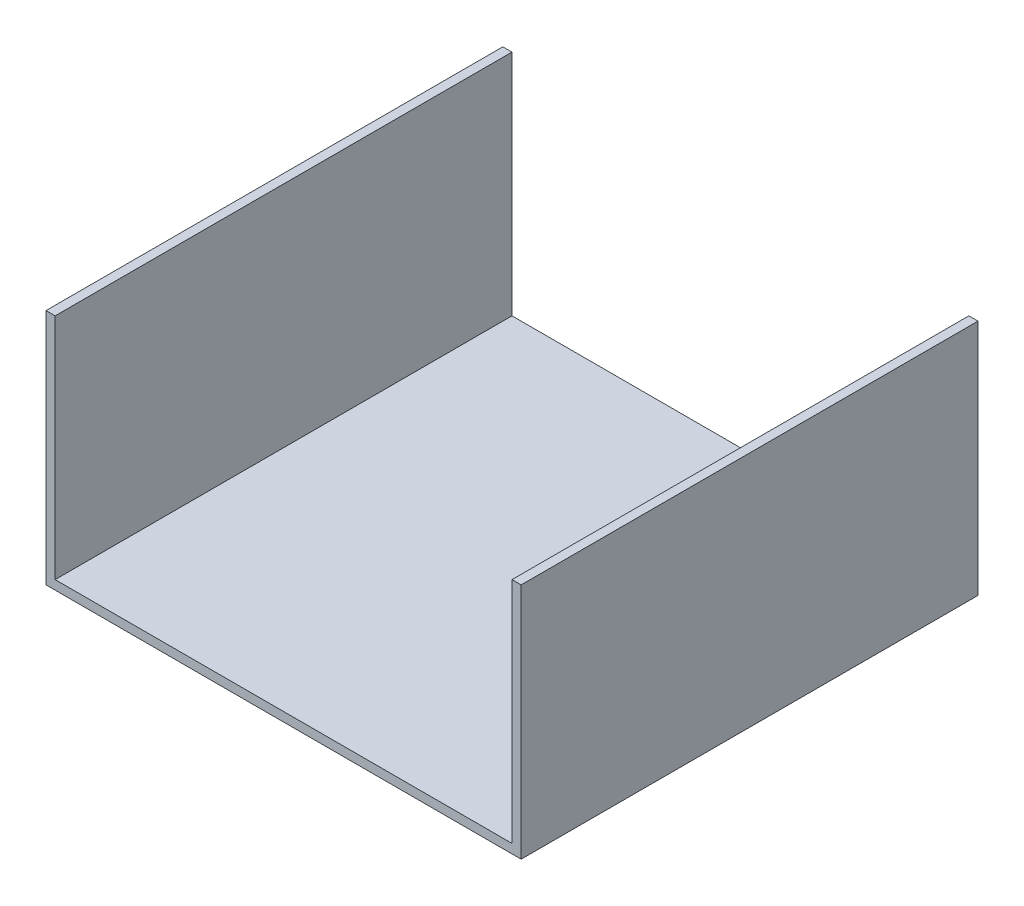
ISO-10303-21;
HEADER;
FILE_DESCRIPTION(('STEP AP214'),'2;1');
FILE_NAME('part.step','',(''),(''),'','','');
FILE_SCHEMA(('AUTOMOTIVE_DESIGN { 1 0 10303 214 1 1 1 1 }'));
ENDSEC;
DATA;
#1=APPLICATION_CONTEXT('core data for automotive mechanical design processes');
#2=APPLICATION_PROTOCOL_DEFINITION('international standard','automotive_design',2000,#1);
#3=PRODUCT_CONTEXT('',#1,'mechanical');
#4=PRODUCT('Part','Part','',(#3));
#5=PRODUCT_RELATED_PRODUCT_CATEGORY('part','',(#4));
#6=PRODUCT_DEFINITION_FORMATION('','',#4);
#7=PRODUCT_DEFINITION_CONTEXT('part definition',#1,'design');
#8=PRODUCT_DEFINITION('design','',#6,#7);
#9=PRODUCT_DEFINITION_SHAPE('','',#8);
#10=(LENGTH_UNIT() NAMED_UNIT(*) SI_UNIT(.MILLI.,.METRE.));
#11=(NAMED_UNIT(*) PLANE_ANGLE_UNIT() SI_UNIT($,.RADIAN.));
#12=(NAMED_UNIT(*) SI_UNIT($,.STERADIAN.) SOLID_ANGLE_UNIT());
#13=UNCERTAINTY_MEASURE_WITH_UNIT(LENGTH_MEASURE(1.E-05),#10,'distance_accuracy_value','');
#14=(GEOMETRIC_REPRESENTATION_CONTEXT(3) GLOBAL_UNCERTAINTY_ASSIGNED_CONTEXT((#13)) GLOBAL_UNIT_ASSIGNED_CONTEXT((#10,
#11,#12)) REPRESENTATION_CONTEXT('',''));
#15=CARTESIAN_POINT('',(0.,0.,0.));
#16=DIRECTION('',(0.,0.,1.));
#17=DIRECTION('',(1.,0.,0.));
#18=AXIS2_PLACEMENT_3D('',#15,#16,#17);
#19=CARTESIAN_POINT('',(-200.,0.,-10000.));
#20=DIRECTION('',(0.,1.,0.));
#21=DIRECTION('',(0.,0.,1.));
#22=AXIS2_PLACEMENT_3D('',#19,#20,#21);
#23=PLANE('',#22);
#24=DIRECTION('',(-1.,0.,0.));
#25=VECTOR('',#24,1.);
#26=CARTESIAN_POINT('',(-200.,0.,0.));
#27=LINE('',#26,#25);
#28=CARTESIAN_POINT('',(0.,0.,0.));
#29=VERTEX_POINT('',#28);
#30=CARTESIAN_POINT('',(-200.,0.,0.));
#31=VERTEX_POINT('',#30);
#32=EDGE_CURVE('E138',#29,#31,#27,.T.);
#33=ORIENTED_EDGE('',*,*,#32,.F.);
#34=DIRECTION('',(0.,0.,1.));
#35=VECTOR('',#34,1.);
#36=CARTESIAN_POINT('',(0.,0.,-10000.));
#37=LINE('',#36,#35);
#38=CARTESIAN_POINT('',(0.,0.,-10000.));
#39=VERTEX_POINT('',#38);
#40=EDGE_CURVE('E11',#39,#29,#37,.T.);
#41=ORIENTED_EDGE('',*,*,#40,.F.);
#42=DIRECTION('',(-1.,0.,0.));
#43=VECTOR('',#42,1.);
#44=CARTESIAN_POINT('',(-200.,0.,-10000.));
#45=LINE('',#44,#43);
#46=CARTESIAN_POINT('',(-200.,0.,-10000.));
#47=VERTEX_POINT('',#46);
#48=EDGE_CURVE('E158',#39,#47,#45,.T.);
#49=ORIENTED_EDGE('',*,*,#48,.T.);
#50=DIRECTION('',(0.,0.,1.));
#51=VECTOR('',#50,1.);
#52=CARTESIAN_POINT('',(-200.,0.,-10000.));
#53=LINE('',#52,#51);
#54=EDGE_CURVE('E44',#47,#31,#53,.T.);
#55=ORIENTED_EDGE('',*,*,#54,.T.);
#56=EDGE_LOOP('',(#33,#41,#49,#55));
#57=FACE_BOUND('',#56,.T.);
#58=ADVANCED_FACE('F41',(#57),#23,.T.);
#59=CARTESIAN_POINT('',(0.,0.,-10000.));
#60=DIRECTION('',(1.,0.,0.));
#61=DIRECTION('',(0.,0.,-1.));
#62=AXIS2_PLACEMENT_3D('',#59,#60,#61);
#63=PLANE('',#62);
#64=DIRECTION('',(0.,1.,0.));
#65=VECTOR('',#64,1.);
#66=CARTESIAN_POINT('',(0.,0.,0.));
#67=LINE('',#66,#65);
#68=CARTESIAN_POINT('',(0.,-5000.,0.));
#69=VERTEX_POINT('',#68);
#70=EDGE_CURVE('E156',#69,#29,#67,.T.);
#71=ORIENTED_EDGE('',*,*,#70,.F.);
#72=DIRECTION('',(0.,0.,1.));
#73=VECTOR('',#72,1.);
#74=CARTESIAN_POINT('',(0.,-5000.,-10000.));
#75=LINE('',#74,#73);
#76=CARTESIAN_POINT('',(0.,-5000.,-10000.));
#77=VERTEX_POINT('',#76);
#78=EDGE_CURVE('E50',#77,#69,#75,.T.);
#79=ORIENTED_EDGE('',*,*,#78,.F.);
#80=DIRECTION('',(0.,1.,0.));
#81=VECTOR('',#80,1.);
#82=CARTESIAN_POINT('',(0.,0.,-10000.));
#83=LINE('',#82,#81);
#84=EDGE_CURVE('E128',#77,#39,#83,.T.);
#85=ORIENTED_EDGE('',*,*,#84,.T.);
#86=ORIENTED_EDGE('',*,*,#40,.T.);
#87=EDGE_LOOP('',(#71,#79,#85,#86));
#88=FACE_BOUND('',#87,.T.);
#89=ADVANCED_FACE('F170',(#88),#63,.T.);
#90=CARTESIAN_POINT('',(0.,-5000.,-10000.));
#91=DIRECTION('',(0.,1.,0.));
#92=DIRECTION('',(0.,0.,1.));
#93=AXIS2_PLACEMENT_3D('',#90,#91,#92);
#94=PLANE('',#93);
#95=DIRECTION('',(-1.,0.,0.));
#96=VECTOR('',#95,1.);
#97=CARTESIAN_POINT('',(0.,-5000.,0.));
#98=LINE('',#97,#96);
#99=CARTESIAN_POINT('',(10000.,-5000.,0.));
#100=VERTEX_POINT('',#99);
#101=EDGE_CURVE('E115',#100,#69,#98,.T.);
#102=ORIENTED_EDGE('',*,*,#101,.F.);
#103=DIRECTION('',(0.,0.,1.));
#104=VECTOR('',#103,1.);
#105=CARTESIAN_POINT('',(10000.,-5000.,-10000.));
#106=LINE('',#105,#104);
#107=CARTESIAN_POINT('',(10000.,-5000.,-10000.));
#108=VERTEX_POINT('',#107);
#109=EDGE_CURVE('E110',#108,#100,#106,.T.);
#110=ORIENTED_EDGE('',*,*,#109,.F.);
#111=DIRECTION('',(-1.,0.,0.));
#112=VECTOR('',#111,1.);
#113=CARTESIAN_POINT('',(0.,-5000.,-10000.));
#114=LINE('',#113,#112);
#115=EDGE_CURVE('E113',#108,#77,#114,.T.);
#116=ORIENTED_EDGE('',*,*,#115,.T.);
#117=ORIENTED_EDGE('',*,*,#78,.T.);
#118=EDGE_LOOP('',(#102,#110,#116,#117));
#119=FACE_BOUND('',#118,.T.);
#120=ADVANCED_FACE('F112',(#119),#94,.T.);
#121=CARTESIAN_POINT('',(10000.,-5000.,-10000.));
#122=DIRECTION('',(-1.,0.,0.));
#123=DIRECTION('',(0.,0.,1.));
#124=AXIS2_PLACEMENT_3D('',#121,#122,#123);
#125=PLANE('',#124);
#126=DIRECTION('',(0.,-1.,0.));
#127=VECTOR('',#126,1.);
#128=CARTESIAN_POINT('',(10000.,-5000.,0.));
#129=LINE('',#128,#127);
#130=CARTESIAN_POINT('',(10000.,0.,0.));
#131=VERTEX_POINT('',#130);
#132=EDGE_CURVE('E153',#131,#100,#129,.T.);
#133=ORIENTED_EDGE('',*,*,#132,.F.);
#134=DIRECTION('',(0.,0.,1.));
#135=VECTOR('',#134,1.);
#136=CARTESIAN_POINT('',(10000.,0.,-10000.));
#137=LINE('',#136,#135);
#138=CARTESIAN_POINT('',(10000.,0.,-10000.));
#139=VERTEX_POINT('',#138);
#140=EDGE_CURVE('E120',#139,#131,#137,.T.);
#141=ORIENTED_EDGE('',*,*,#140,.F.);
#142=DIRECTION('',(0.,-1.,0.));
#143=VECTOR('',#142,1.);
#144=CARTESIAN_POINT('',(10000.,-5000.,-10000.));
#145=LINE('',#144,#143);
#146=EDGE_CURVE('E126',#139,#108,#145,.T.);
#147=ORIENTED_EDGE('',*,*,#146,.T.);
#148=ORIENTED_EDGE('',*,*,#109,.T.);
#149=EDGE_LOOP('',(#133,#141,#147,#148));
#150=FACE_BOUND('',#149,.T.);
#151=ADVANCED_FACE('F130',(#150),#125,.T.);
#152=CARTESIAN_POINT('',(10000.,0.,-10000.));
#153=DIRECTION('',(0.,1.,0.));
#154=DIRECTION('',(0.,0.,1.));
#155=AXIS2_PLACEMENT_3D('',#152,#153,#154);
#156=PLANE('',#155);
#157=DIRECTION('',(-1.,0.,0.));
#158=VECTOR('',#157,1.);
#159=CARTESIAN_POINT('',(10000.,0.,0.));
#160=LINE('',#159,#158);
#161=CARTESIAN_POINT('',(10200.,0.,0.));
#162=VERTEX_POINT('',#161);
#163=EDGE_CURVE('E150',#162,#131,#160,.T.);
#164=ORIENTED_EDGE('',*,*,#163,.F.);
#165=DIRECTION('',(0.,0.,1.));
#166=VECTOR('',#165,1.);
#167=CARTESIAN_POINT('',(10200.,0.,-10000.));
#168=LINE('',#167,#166);
#169=CARTESIAN_POINT('',(10200.,0.,-10000.));
#170=VERTEX_POINT('',#169);
#171=EDGE_CURVE('E162',#170,#162,#168,.T.);
#172=ORIENTED_EDGE('',*,*,#171,.F.);
#173=DIRECTION('',(-1.,0.,0.));
#174=VECTOR('',#173,1.);
#175=CARTESIAN_POINT('',(10000.,0.,-10000.));
#176=LINE('',#175,#174);
#177=EDGE_CURVE('E131',#170,#139,#176,.T.);
#178=ORIENTED_EDGE('',*,*,#177,.T.);
#179=ORIENTED_EDGE('',*,*,#140,.T.);
#180=EDGE_LOOP('',(#164,#172,#178,#179));
#181=FACE_BOUND('',#180,.T.);
#182=ADVANCED_FACE('F183',(#181),#156,.T.);
#183=CARTESIAN_POINT('',(10200.,-5200.,-10000.));
#184=DIRECTION('',(1.,0.,0.));
#185=DIRECTION('',(0.,0.,-1.));
#186=AXIS2_PLACEMENT_3D('',#183,#184,#185);
#187=PLANE('',#186);
#188=DIRECTION('',(0.,1.,0.));
#189=VECTOR('',#188,1.);
#190=CARTESIAN_POINT('',(10200.,-5200.,0.));
#191=LINE('',#190,#189);
#192=CARTESIAN_POINT('',(10200.,-5200.,0.));
#193=VERTEX_POINT('',#192);
#194=EDGE_CURVE('E147',#193,#162,#191,.T.);
#195=ORIENTED_EDGE('',*,*,#194,.F.);
#196=DIRECTION('',(0.,0.,1.));
#197=VECTOR('',#196,1.);
#198=CARTESIAN_POINT('',(10200.,-5200.,-10000.));
#199=LINE('',#198,#197);
#200=CARTESIAN_POINT('',(10200.,-5200.,-10000.));
#201=VERTEX_POINT('',#200);
#202=EDGE_CURVE('E164',#201,#193,#199,.T.);
#203=ORIENTED_EDGE('',*,*,#202,.F.);
#204=DIRECTION('',(0.,1.,0.));
#205=VECTOR('',#204,1.);
#206=CARTESIAN_POINT('',(10200.,-5200.,-10000.));
#207=LINE('',#206,#205);
#208=EDGE_CURVE('E133',#201,#170,#207,.T.);
#209=ORIENTED_EDGE('',*,*,#208,.T.);
#210=ORIENTED_EDGE('',*,*,#171,.T.);
#211=EDGE_LOOP('',(#195,#203,#209,#210));
#212=FACE_BOUND('',#211,.T.);
#213=ADVANCED_FACE('F186',(#212),#187,.T.);
#214=CARTESIAN_POINT('',(-200.,-5200.,-10000.));
#215=DIRECTION('',(0.,-1.,0.));
#216=DIRECTION('',(0.,0.,-1.));
#217=AXIS2_PLACEMENT_3D('',#214,#215,#216);
#218=PLANE('',#217);
#219=DIRECTION('',(1.,0.,0.));
#220=VECTOR('',#219,1.);
#221=CARTESIAN_POINT('',(-200.,-5200.,0.));
#222=LINE('',#221,#220);
#223=CARTESIAN_POINT('',(-200.,-5200.,0.));
#224=VERTEX_POINT('',#223);
#225=EDGE_CURVE('E144',#224,#193,#222,.T.);
#226=ORIENTED_EDGE('',*,*,#225,.F.);
#227=DIRECTION('',(0.,0.,1.));
#228=VECTOR('',#227,1.);
#229=CARTESIAN_POINT('',(-200.,-5200.,-10000.));
#230=LINE('',#229,#228);
#231=CARTESIAN_POINT('',(-200.,-5200.,-10000.));
#232=VERTEX_POINT('',#231);
#233=EDGE_CURVE('E165',#232,#224,#230,.T.);
#234=ORIENTED_EDGE('',*,*,#233,.F.);
#235=DIRECTION('',(1.,0.,0.));
#236=VECTOR('',#235,1.);
#237=CARTESIAN_POINT('',(-200.,-5200.,-10000.));
#238=LINE('',#237,#236);
#239=EDGE_CURVE('E281',#232,#201,#238,.T.);
#240=ORIENTED_EDGE('',*,*,#239,.T.);
#241=ORIENTED_EDGE('',*,*,#202,.T.);
#242=EDGE_LOOP('',(#226,#234,#240,#241));
#243=FACE_BOUND('',#242,.T.);
#244=ADVANCED_FACE('F190',(#243),#218,.T.);
#245=CARTESIAN_POINT('',(-200.,0.,-10000.));
#246=DIRECTION('',(-1.,0.,0.));
#247=DIRECTION('',(0.,0.,1.));
#248=AXIS2_PLACEMENT_3D('',#245,#246,#247);
#249=PLANE('',#248);
#250=DIRECTION('',(0.,-1.,0.));
#251=VECTOR('',#250,1.);
#252=CARTESIAN_POINT('',(-200.,0.,0.));
#253=LINE('',#252,#251);
#254=EDGE_CURVE('E141',#31,#224,#253,.T.);
#255=ORIENTED_EDGE('',*,*,#254,.F.);
#256=ORIENTED_EDGE('',*,*,#54,.F.);
#257=DIRECTION('',(0.,-1.,0.));
#258=VECTOR('',#257,1.);
#259=CARTESIAN_POINT('',(-200.,0.,-10000.));
#260=LINE('',#259,#258);
#261=EDGE_CURVE('E282',#47,#232,#260,.T.);
#262=ORIENTED_EDGE('',*,*,#261,.T.);
#263=ORIENTED_EDGE('',*,*,#233,.T.);
#264=EDGE_LOOP('',(#255,#256,#262,#263));
#265=FACE_BOUND('',#264,.T.);
#266=ADVANCED_FACE('F167',(#265),#249,.T.);
#267=CARTESIAN_POINT('',(0.,0.,-10000.));
#268=DIRECTION('',(0.,0.,-1.));
#269=DIRECTION('',(-1.,0.,0.));
#270=AXIS2_PLACEMENT_3D('',#267,#268,#269);
#271=PLANE('',#270);
#272=ORIENTED_EDGE('',*,*,#48,.F.);
#273=ORIENTED_EDGE('',*,*,#84,.F.);
#274=ORIENTED_EDGE('',*,*,#115,.F.);
#275=ORIENTED_EDGE('',*,*,#146,.F.);
#276=ORIENTED_EDGE('',*,*,#177,.F.);
#277=ORIENTED_EDGE('',*,*,#208,.F.);
#278=ORIENTED_EDGE('',*,*,#239,.F.);
#279=ORIENTED_EDGE('',*,*,#261,.F.);
#280=EDGE_LOOP('',(#272,#273,#274,#275,#276,#277,#278,#279));
#281=FACE_BOUND('',#280,.T.);
#282=ADVANCED_FACE('F124',(#281),#271,.T.);
#283=CARTESIAN_POINT('',(0.,0.,0.));
#284=DIRECTION('',(0.,0.,-1.));
#285=DIRECTION('',(-1.,0.,0.));
#286=AXIS2_PLACEMENT_3D('',#283,#284,#285);
#287=PLANE('',#286);
#288=ORIENTED_EDGE('',*,*,#32,.T.);
#289=ORIENTED_EDGE('',*,*,#254,.T.);
#290=ORIENTED_EDGE('',*,*,#225,.T.);
#291=ORIENTED_EDGE('',*,*,#194,.T.);
#292=ORIENTED_EDGE('',*,*,#163,.T.);
#293=ORIENTED_EDGE('',*,*,#132,.T.);
#294=ORIENTED_EDGE('',*,*,#101,.T.);
#295=ORIENTED_EDGE('',*,*,#70,.T.);
#296=EDGE_LOOP('',(#288,#289,#290,#291,#292,#293,#294,#295));
#297=FACE_BOUND('',#296,.T.);
#298=ADVANCED_FACE('F169',(#297),#287,.F.);
#299=CLOSED_SHELL('',(#58,#89,#120,#151,#182,#213,#244,#266,#282,#298));
#300=MANIFOLD_SOLID_BREP('B2',#299);
#301=ADVANCED_BREP_SHAPE_REPRESENTATION('',(#18,#300),#14);
#302=SHAPE_DEFINITION_REPRESENTATION(#9,#301);
ENDSEC;
END-ISO-10303-21;
